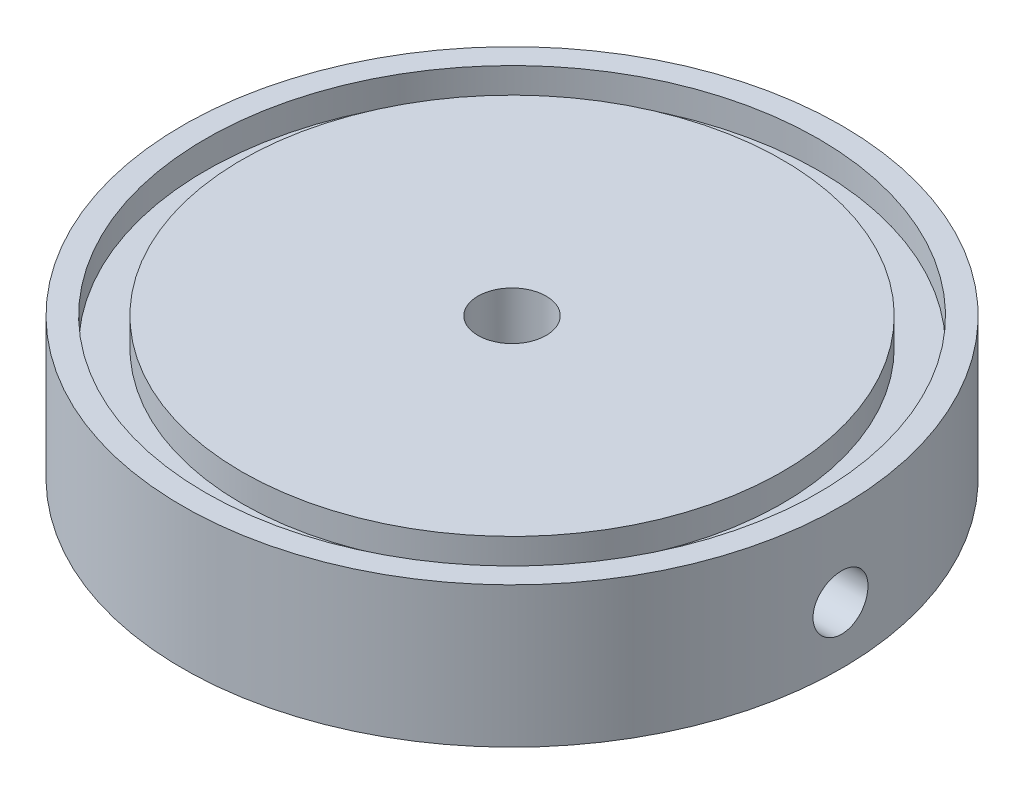
ISO-10303-21;
HEADER;
FILE_DESCRIPTION(('STEP AP214'),'2;1');
FILE_NAME('part.step','',(''),(''),'','','');
FILE_SCHEMA(('AUTOMOTIVE_DESIGN { 1 0 10303 214 1 1 1 1 }'));
ENDSEC;
DATA;
#1=APPLICATION_CONTEXT('core data for automotive mechanical design processes');
#2=APPLICATION_PROTOCOL_DEFINITION('international standard','automotive_design',2000,#1);
#3=PRODUCT_CONTEXT('',#1,'mechanical');
#4=PRODUCT('Part','Part','',(#3));
#5=PRODUCT_RELATED_PRODUCT_CATEGORY('part','',(#4));
#6=PRODUCT_DEFINITION_FORMATION('','',#4);
#7=PRODUCT_DEFINITION_CONTEXT('part definition',#1,'design');
#8=PRODUCT_DEFINITION('design','',#6,#7);
#9=PRODUCT_DEFINITION_SHAPE('','',#8);
#10=(LENGTH_UNIT() NAMED_UNIT(*) SI_UNIT(.MILLI.,.METRE.));
#11=(NAMED_UNIT(*) PLANE_ANGLE_UNIT() SI_UNIT($,.RADIAN.));
#12=(NAMED_UNIT(*) SI_UNIT($,.STERADIAN.) SOLID_ANGLE_UNIT());
#13=UNCERTAINTY_MEASURE_WITH_UNIT(LENGTH_MEASURE(1.E-05),#10,'distance_accuracy_value','');
#14=(GEOMETRIC_REPRESENTATION_CONTEXT(3) GLOBAL_UNCERTAINTY_ASSIGNED_CONTEXT((#13)) GLOBAL_UNIT_ASSIGNED_CONTEXT((#10,
#11,#12)) REPRESENTATION_CONTEXT('',''));
#15=CARTESIAN_POINT('',(0.,0.,0.));
#16=DIRECTION('',(0.,0.,1.));
#17=DIRECTION('',(1.,0.,0.));
#18=AXIS2_PLACEMENT_3D('',#15,#16,#17);
#19=CARTESIAN_POINT('',(38.1,-2.21742000000442,0.));
#20=DIRECTION('',(-1.,0.,0.));
#21=DIRECTION('',(0.,0.,1.));
#22=AXIS2_PLACEMENT_3D('',#19,#20,#21);
#23=CYLINDRICAL_SURFACE('',#22,1.7272);
#24=CARTESIAN_POINT('',(4.78697067852523,-0.665171235261735,-0.757458653891286));
#25=CARTESIAN_POINT('',(4.75625422953606,-0.635930548996629,-0.697533372590927));
#26=CARTESIAN_POINT('',(4.72893216465884,-0.609470565960408,-0.634482388105727));
#27=CARTESIAN_POINT('',(4.68213605994151,-0.563643555776028,-0.50306921919846));
#28=CARTESIAN_POINT('',(4.66266042825234,-0.544275090005549,-0.43470811542969));
#29=CARTESIAN_POINT('',(4.63231211537771,-0.513889935709503,-0.293951985284614));
#30=CARTESIAN_POINT('',(4.62147760516662,-0.502910312618153,-0.221540556224796));
#31=CARTESIAN_POINT('',(4.60903870850558,-0.490291871867994,-0.0751217236692977));
#32=CARTESIAN_POINT('',(4.60743266312804,-0.4886513753893,-0.00111460941827956));
#33=CARTESIAN_POINT('',(4.61336361058703,-0.494679348910777,0.14245074301311));
#34=CARTESIAN_POINT('',(4.62045190693207,-0.501890992455949,0.212047848188066));
#35=CARTESIAN_POINT('',(4.64273463588662,-0.52434487711953,0.348574343831421));
#36=CARTESIAN_POINT('',(4.65792891984075,-0.539586970967784,0.415503783197841));
#37=CARTESIAN_POINT('',(4.69608404535905,-0.577354018883261,0.545967186595631));
#38=CARTESIAN_POINT('',(4.71914668265209,-0.599974248749584,0.609443314302014));
#39=CARTESIAN_POINT('',(4.77210476899229,-0.651100559562644,0.730899392454943));
#40=CARTESIAN_POINT('',(4.8020029862676,-0.67960902463503,0.78887710269346));
#41=CARTESIAN_POINT('',(4.88192024901478,-0.754526280160981,0.922671170204856));
#42=CARTESIAN_POINT('',(4.93503823722558,-0.803331738258821,0.995297986812561));
#43=CARTESIAN_POINT('',(5.05039924550062,-0.906776183432052,1.12807541459497));
#44=CARTESIAN_POINT('',(5.11266285154989,-0.961428253273451,1.18819712022933));
#45=CARTESIAN_POINT('',(5.27630299315434,-1.10192049508507,1.32385964569084));
#46=CARTESIAN_POINT('',(5.3817783180933,-1.18980158095095,1.39228992218148));
#47=CARTESIAN_POINT('',(5.60174638633848,-1.36815861695864,1.5077448471841));
#48=CARTESIAN_POINT('',(5.71625795579938,-1.45863972073563,1.55472334408847));
#49=CARTESIAN_POINT('',(5.92763078684595,-1.6221177422067,1.62328310146144));
#50=CARTESIAN_POINT('',(6.02354233176437,-1.69505896722171,1.64804007283235));
#51=CARTESIAN_POINT('',(6.21772870089238,-1.84064222160262,1.68729031027404));
#52=CARTESIAN_POINT('',(6.31600494010158,-1.91328403974576,1.70177726461788));
#53=CARTESIAN_POINT('',(6.51422110198702,-2.05805523217336,1.72138595920732));
#54=CARTESIAN_POINT('',(6.61416464288552,-2.13018281605391,1.72648360307503));
#55=CARTESIAN_POINT('',(6.81474196617157,-2.27348375977993,1.72777573553129));
#56=CARTESIAN_POINT('',(6.91537557639753,-2.34465734541485,1.72397236958763));
#57=CARTESIAN_POINT('',(7.12168455036751,-2.48933143282605,1.70729152009641));
#58=CARTESIAN_POINT('',(7.22736495397619,-2.56277469486742,1.69397784330079));
#59=CARTESIAN_POINT('',(7.43816471586283,-2.70817059405486,1.65770938961245));
#60=CARTESIAN_POINT('',(7.54328385102441,-2.78012266704927,1.63475103133998));
#61=CARTESIAN_POINT('',(7.75166250948726,-2.92184595478182,1.57885512147153));
#62=CARTESIAN_POINT('',(7.85492808751473,-2.99162522016489,1.54596092672259));
#63=CARTESIAN_POINT('',(8.05894219324114,-3.12874148339489,1.46931337138522));
#64=CARTESIAN_POINT('',(8.15969293261694,-3.19608065255697,1.42556995117591));
#65=CARTESIAN_POINT('',(8.34279146757036,-3.31790402197057,1.33308588479146));
#66=CARTESIAN_POINT('',(8.42567839901411,-3.37282958961099,1.28600741540689));
#67=CARTESIAN_POINT('',(8.58722294170047,-3.47952178902698,1.18148485729486));
#68=CARTESIAN_POINT('',(8.66587290467,-3.5312827295557,1.12402278843746));
#69=CARTESIAN_POINT('',(8.81730672629618,-3.63066638778965,0.996297196430853));
#70=CARTESIAN_POINT('',(8.89000397489234,-3.67822860021844,0.92588119298211));
#71=CARTESIAN_POINT('',(9.02390983800553,-3.76564177324054,0.770767288220577));
#72=CARTESIAN_POINT('',(9.08516940480062,-3.80552695907134,0.686136080992624));
#73=CARTESIAN_POINT('',(9.16525579997495,-3.85759296052293,0.543951134303041));
#74=CARTESIAN_POINT('',(9.19067638740805,-3.87410210849061,0.491712966462728));
#75=CARTESIAN_POINT('',(9.23445776303899,-3.90251839072471,0.383148433261553));
#76=CARTESIAN_POINT('',(9.25282485409157,-3.91442963363101,0.326825771481761));
#77=CARTESIAN_POINT('',(9.2810805548836,-3.93274790973384,0.210605150804604));
#78=CARTESIAN_POINT('',(9.29088987886069,-3.93910347186559,0.150679144383298));
#79=CARTESIAN_POINT('',(9.30064503860262,-3.94542396950302,0.0296980409525031));
#80=CARTESIAN_POINT('',(9.30059713576054,-3.94539296181135,-0.0313563146720226));
#81=CARTESIAN_POINT('',(9.29122890951459,-3.93932310941666,-0.14549919115933));
#82=CARTESIAN_POINT('',(9.28294617064534,-3.93395654173932,-0.19871495761312));
#83=CARTESIAN_POINT('',(9.25936944941119,-3.91867309715279,-0.302875861226293));
#84=CARTESIAN_POINT('',(9.24407157626598,-3.90875369511765,-0.353819721098759));
#85=CARTESIAN_POINT('',(9.20096314906789,-3.88078203616598,-0.470334270253999));
#86=CARTESIAN_POINT('',(9.17063082628091,-3.8610876329992,-0.534571115967057));
#87=CARTESIAN_POINT('',(9.10179725928312,-3.81633686068641,-0.656447461342044));
#88=CARTESIAN_POINT('',(9.06327774394699,-3.79126849753343,-0.71407175352864));
#89=CARTESIAN_POINT('',(8.95707802252543,-3.72204583322611,-0.853427038623287));
#90=CARTESIAN_POINT('',(8.88517496885591,-3.67508247862191,-0.930507716123498));
#91=CARTESIAN_POINT('',(8.73276113117903,-3.57522834803393,-1.07099258277773));
#92=CARTESIAN_POINT('',(8.65223087948544,-3.52232415272656,-1.13436482302106));
#93=CARTESIAN_POINT('',(8.4965509103134,-3.41968473971726,-1.24199663584822));
#94=CARTESIAN_POINT('',(8.42204803621105,-3.37042166648861,-1.2876673135239));
#95=CARTESIAN_POINT('',(8.27019868913385,-3.26966196891126,-1.37123845324186));
#96=CARTESIAN_POINT('',(8.19285021193152,-3.21816376553295,-1.40913331005771));
#97=CARTESIAN_POINT('',(8.03606737113653,-3.11336290973551,-1.47798619281361));
#98=CARTESIAN_POINT('',(7.9566289112447,-3.06005664361635,-1.50892925406542));
#99=CARTESIAN_POINT('',(7.79642991727826,-2.9520721804854,-1.56434901597961));
#100=CARTESIAN_POINT('',(7.71566903621436,-2.89739362132667,-1.58882398964756));
#101=CARTESIAN_POINT('',(7.51886407635085,-2.76346880539695,-1.64078665460497));
#102=CARTESIAN_POINT('',(7.40238391256857,-2.68363910098292,-1.66514898834206));
#103=CARTESIAN_POINT('',(7.16877253520805,-2.52213916613266,-1.70212491606884));
#104=CARTESIAN_POINT('',(7.05164099265636,-2.44046792696191,-1.71473190244668));
#105=CARTESIAN_POINT('',(6.81786246557642,-2.27575422936096,-1.72818887092601));
#106=CARTESIAN_POINT('',(6.70121506046376,-2.19271359547437,-1.72905340229935));
#107=CARTESIAN_POINT('',(6.46936664569442,-2.02557001776367,-1.718551954237));
#108=CARTESIAN_POINT('',(6.35416470504726,-1.94146783596734,-1.70719430424913));
#109=CARTESIAN_POINT('',(6.10612982867684,-1.75758824532498,-1.66797102101825));
#110=CARTESIAN_POINT('',(5.97377251112206,-1.65766333372211,-1.63754625658014));
#111=CARTESIAN_POINT('',(5.78024403318545,-1.50818878630032,-1.5757846531622));
#112=CARTESIAN_POINT('',(5.71659631436929,-1.45845476401426,-1.55252396450989));
#113=CARTESIAN_POINT('',(5.59146640663726,-1.35941418178603,-1.50006247466696));
#114=CARTESIAN_POINT('',(5.52998347762886,-1.31010748018511,-1.47086372715697));
#115=CARTESIAN_POINT('',(5.38728220140971,-1.19400874201817,-1.39369146486403));
#116=CARTESIAN_POINT('',(5.30730539323905,-1.12759071336931,-1.34278304649939));
#117=CARTESIAN_POINT('',(5.15519035730813,-0.998393264074577,-1.22666501174239));
#118=CARTESIAN_POINT('',(5.08303677989516,-0.935606835294663,-1.16148418671653));
#119=CARTESIAN_POINT('',(4.97257932380863,-0.837171800965483,-1.04018392483871));
#120=CARTESIAN_POINT('',(4.93111600422493,-0.799563137637129,-0.988538194437073));
#121=CARTESIAN_POINT('',(4.85421423295613,-0.728701068483842,-0.878195991255441));
#122=CARTESIAN_POINT('',(4.81877313109346,-0.695445748384531,-0.819502639407449));
#123=CARTESIAN_POINT('',(4.78697067852523,-0.665171235261735,-0.757458653891286));
#124=B_SPLINE_CURVE_WITH_KNOTS('',3,(#24,#25,#26,#27,#28,#29,#30,#31,#32,#33,#34,#35,#36,#37,
#38,#39,#40,#41,#42,#43,#44,#45,#46,#47,#48,#49,#50,#51,#52,#53,#54,#55,#56,#57,#58,#59,#60,#61,
#62,#63,#64,#65,#66,#67,#68,#69,#70,#71,#72,#73,#74,#75,#76,#77,#78,#79,#80,#81,#82,#83,#84,#85,
#86,#87,#88,#89,#90,#91,#92,#93,#94,#95,#96,#97,#98,#99,#100,#101,#102,#103,#104,#105,#106,#107,
#108,#109,#110,#111,#112,#113,#114,#115,#116,#117,#118,#119,#120,#121,#122,#123),.UNSPECIFIED.,
.T.,.F.,(4,2,2,2,2,2,2,2,2,2,2,2,2,2,2,2,2,2,2,2,2,2,2,2,2,2,2,2,2,2,2,2,2,2,2,2,2,2,2,2,2,2,2,
2,2,2,2,2,2,4),(0.,0.220037701199797,0.440030739634494,0.660990266743245,0.881910072475531,
1.0918930860338,1.30187224885474,1.51467803475821,1.7275701544815,2.03292991566579,
2.33898785804739,2.79662553769652,3.25524319850504,3.62380199616927,3.99258710607117,
4.36231734070705,4.73195846605978,5.11974146230725,5.50766858228649,5.89392678405249,
6.27983238368667,6.60939257235968,6.93952898976279,7.27383398599623,7.60661221229129,
7.78721266741637,7.96765136419895,8.1497445532452,8.33172207552924,8.4933480581582,
8.65506379148425,8.87497648798497,9.09538520940238,9.4396527596983,9.78471421651974,
10.0852441851602,10.3859900366169,10.6873772102741,10.9888447738919,11.4181810801262,
11.8477585685627,12.2768037483284,12.705556717773,13.2099601805762,13.4619379183584,
13.7138286572654,14.0601429246107,14.4057649135186,14.6336827764579,14.8615000791056),.UNSPECIFIED.);
#125=CARTESIAN_POINT('',(4.78697067852523,-0.665171235261735,-0.757458653891286));
#126=VERTEX_POINT('',#125);
#127=EDGE_CURVE('E157',#126,#126,#124,.T.);
#128=ORIENTED_EDGE('',*,*,#127,.F.);
#129=EDGE_LOOP('',(#128));
#130=FACE_BOUND('',#129,.T.);
#131=CARTESIAN_POINT('',(28.575,-2.21742000000442,0.));
#132=DIRECTION('',(1.,0.,0.));
#133=DIRECTION('',(0.,0.,-1.));
#134=AXIS2_PLACEMENT_3D('',#131,#132,#133);
#135=CIRCLE('',#134,1.7272);
#136=CARTESIAN_POINT('',(28.575,-2.21742000000442,-1.7272));
#137=VERTEX_POINT('',#136);
#138=EDGE_CURVE('E53',#137,#137,#135,.T.);
#139=ORIENTED_EDGE('',*,*,#138,.T.);
#140=EDGE_LOOP('',(#139));
#141=FACE_BOUND('',#140,.T.);
#142=ADVANCED_FACE('F31',(#130,#141),#23,.F.);
#143=CARTESIAN_POINT('',(3.94335000000002,7.43457999999557,0.));
#144=DIRECTION('',(0.,1.,0.));
#145=DIRECTION('',(0.,0.,1.));
#146=AXIS2_PLACEMENT_3D('',#143,#144,#145);
#147=PLANE('',#146);
#148=CARTESIAN_POINT('',(0.,7.43457999999557,0.));
#149=DIRECTION('',(0.,-1.,0.));
#150=DIRECTION('',(0.,0.,-1.));
#151=AXIS2_PLACEMENT_3D('',#148,#149,#150);
#152=CIRCLE('',#151,3.94334999999996);
#153=CARTESIAN_POINT('',(0.,7.43457999999557,-3.94334999999996));
#154=VERTEX_POINT('',#153);
#155=EDGE_CURVE('E163',#154,#154,#152,.T.);
#156=ORIENTED_EDGE('',*,*,#155,.T.);
#157=EDGE_LOOP('',(#156));
#158=FACE_BOUND('',#157,.T.);
#159=CARTESIAN_POINT('',(0.,7.43457999999557,0.));
#160=DIRECTION('',(0.,1.,0.));
#161=DIRECTION('',(0.,0.,1.));
#162=AXIS2_PLACEMENT_3D('',#159,#160,#161);
#163=CIRCLE('',#162,31.242);
#164=CARTESIAN_POINT('',(0.,7.43457999999557,31.242));
#165=VERTEX_POINT('',#164);
#166=EDGE_CURVE('E315',#165,#165,#163,.T.);
#167=ORIENTED_EDGE('',*,*,#166,.T.);
#168=EDGE_LOOP('',(#167));
#169=FACE_BOUND('',#168,.T.);
#170=ADVANCED_FACE('F154',(#158,#169),#147,.T.);
#171=CARTESIAN_POINT('',(0.,-4.42701431069281E-12,0.));
#172=DIRECTION('',(0.,-1.,0.));
#173=DIRECTION('',(0.,0.,-1.));
#174=AXIS2_PLACEMENT_3D('',#171,#172,#173);
#175=CONICAL_SURFACE('',#174,3.94334999999996,0.936005153411921);
#176=CARTESIAN_POINT('',(0.,-0.380669706682652,0.));
#177=DIRECTION('',(0.,1.,0.));
#178=DIRECTION('',(0.,0.,1.));
#179=AXIS2_PLACEMENT_3D('',#176,#177,#178);
#180=CIRCLE('',#179,4.46022808609899);
#181=CARTESIAN_POINT('',(0.,-0.380669706682652,4.46022808609899));
#182=VERTEX_POINT('',#181);
#183=EDGE_CURVE('E10',#182,#182,#180,.T.);
#184=ORIENTED_EDGE('',*,*,#183,.T.);
#185=EDGE_LOOP('',(#184));
#186=FACE_BOUND('',#185,.T.);
#187=CARTESIAN_POINT('',(0.,-4.06400000000444,0.));
#188=DIRECTION('',(0.,-1.,0.));
#189=DIRECTION('',(0.,0.,-1.));
#190=AXIS2_PLACEMENT_3D('',#187,#188,#189);
#191=CIRCLE('',#190,9.46149999999993);
#192=CARTESIAN_POINT('',(0.,-4.06400000000444,-9.46149999999993));
#193=VERTEX_POINT('',#192);
#194=EDGE_CURVE('E46',#193,#193,#191,.T.);
#195=ORIENTED_EDGE('',*,*,#194,.T.);
#196=EDGE_LOOP('',(#195));
#197=FACE_BOUND('',#196,.T.);
#198=ORIENTED_EDGE('',*,*,#127,.T.);
#199=EDGE_LOOP('',(#198));
#200=FACE_BOUND('',#199,.T.);
#201=ADVANCED_FACE('F168',(#186,#197,#200),#175,.F.);
#202=CARTESIAN_POINT('',(0.,101.604645460313,0.));
#203=DIRECTION('',(0.,-1.,0.));
#204=DIRECTION('',(0.,0.,-1.));
#205=AXIS2_PLACEMENT_3D('',#202,#203,#204);
#206=CYLINDRICAL_SURFACE('',#205,38.1);
#207=CARTESIAN_POINT('',(37.967477859347,-2.21742000000442,-3.175));
#208=CARTESIAN_POINT('',(37.9674796148514,-2.03941137459055,-3.174992223886));
#209=CARTESIAN_POINT('',(37.9687432124492,-1.86128156393965,-3.15997936696993));
#210=CARTESIAN_POINT('',(37.9736610260084,-1.50995056040072,-3.10031123355846));
#211=CARTESIAN_POINT('',(37.9773179506743,-1.3367551842216,-3.05562236969804));
#212=CARTESIAN_POINT('',(37.9866053672743,-1.00043235231119,-2.93790365154258));
#213=CARTESIAN_POINT('',(37.9922347401669,-0.837299249473696,-2.86488986449255));
#214=CARTESIAN_POINT('',(38.0048313657025,-0.525642855211689,-2.69262246744107));
#215=CARTESIAN_POINT('',(38.0117983322355,-0.37711644968433,-2.59337446720523));
#216=CARTESIAN_POINT('',(38.0263052267685,-0.0984694402681578,-2.37118060325433));
#217=CARTESIAN_POINT('',(38.033846422922,0.0316084961604079,-2.24818130945098));
#218=CARTESIAN_POINT('',(38.0486404573867,0.269299582801398,-1.98208938314658));
#219=CARTESIAN_POINT('',(38.0558932830885,0.376911751528684,-1.83899587322542));
#220=CARTESIAN_POINT('',(38.0693053861151,0.566758501528934,-1.53652297885541));
#221=CARTESIAN_POINT('',(38.0754630672337,0.648956167096674,-1.3771203474996));
#222=CARTESIAN_POINT('',(38.0859774147698,0.785404484296812,-1.04671622158357));
#223=CARTESIAN_POINT('',(38.0903341127107,0.839655625094882,-0.875714930101312));
#224=CARTESIAN_POINT('',(38.0967467506224,0.91854808623849,-0.527392252134299));
#225=CARTESIAN_POINT('',(38.0988080535635,0.943258435799819,-0.35008660053762));
#226=CARTESIAN_POINT('',(38.1004158213117,0.96258127010665,0.00616674500017729));
#227=CARTESIAN_POINT('',(38.0999623328846,0.95719431455252,0.185114408344068));
#228=CARTESIAN_POINT('',(38.0965960392816,0.916531910326071,0.539104051072238));
#229=CARTESIAN_POINT('',(38.0936893421403,0.881330692867241,0.71415462348008));
#230=CARTESIAN_POINT('',(38.0857505953842,0.782154420690949,1.05585407967778));
#231=CARTESIAN_POINT('',(38.0807185255475,0.718179092201481,1.22250288351202));
#232=CARTESIAN_POINT('',(38.0690846412153,0.563187890894124,1.54290446002202));
#233=CARTESIAN_POINT('',(38.0624808988053,0.472138773144508,1.69664107794224));
#234=CARTESIAN_POINT('',(38.0484457872988,0.265608683983459,1.98667794141065));
#235=CARTESIAN_POINT('',(38.0410144014161,0.150127216994747,2.12297783318834));
#236=CARTESIAN_POINT('',(38.0261325057258,-0.102407846862345,2.37470621318252));
#237=CARTESIAN_POINT('',(38.0186820064471,-0.239525945954131,2.49007000291146));
#238=CARTESIAN_POINT('',(38.004624326273,-0.531217203748763,2.69615157657959));
#239=CARTESIAN_POINT('',(37.9980171460728,-0.685790376840318,2.78686934020215));
#240=CARTESIAN_POINT('',(37.9863929785793,-1.00804944367989,2.94108125458357));
#241=CARTESIAN_POINT('',(37.9813761874431,-1.17573695176081,3.00457204753268));
#242=CARTESIAN_POINT('',(37.9735046116394,-1.51944297981634,3.10247984731552));
#243=CARTESIAN_POINT('',(37.9706497815192,-1.69546132456204,3.136897465381));
#244=CARTESIAN_POINT('',(37.967432729465,-2.05026636731748,3.17560002074756));
#245=CARTESIAN_POINT('',(37.9670630442666,-2.22904315889829,3.17997518092429));
#246=CARTESIAN_POINT('',(37.9688384390387,-2.584787641092,3.15870496351731));
#247=CARTESIAN_POINT('',(37.9709834955532,-2.7617553485634,3.13305986594426));
#248=CARTESIAN_POINT('',(37.9775398735957,-3.10859917966798,3.05255231894487));
#249=CARTESIAN_POINT('',(37.981947928906,-3.27848514343725,2.99773197439151));
#250=CARTESIAN_POINT('',(37.9925309166027,-3.6066478608743,2.86047288657974));
#251=CARTESIAN_POINT('',(37.9987058773397,-3.76492442821541,2.77803370016694));
#252=CARTESIAN_POINT('',(38.0121450024562,-4.06578832580058,2.58764877433316));
#253=CARTESIAN_POINT('',(38.0194117192608,-4.20833749516941,2.47964291244999));
#254=CARTESIAN_POINT('',(38.0342069443175,-4.47331446238362,2.24127735771924));
#255=CARTESIAN_POINT('',(38.0417354570727,-4.59574191391979,2.11091728021842));
#256=CARTESIAN_POINT('',(38.0562282152053,-4.8173081383243,1.83115385899478));
#257=CARTESIAN_POINT('',(38.0631910120889,-4.91638829078934,1.68170400390121));
#258=CARTESIAN_POINT('',(38.0757469329061,-5.08804517557185,1.36823511345573));
#259=CARTESIAN_POINT('',(38.0813400705265,-5.16062217273458,1.20421622371214));
#260=CARTESIAN_POINT('',(38.0905198062144,-5.27711188167546,0.866475212585343));
#261=CARTESIAN_POINT('',(38.0941089410165,-5.32106084359246,0.692765665902921));
#262=CARTESIAN_POINT('',(38.0988865697222,-5.37916540927367,0.340401843535496));
#263=CARTESIAN_POINT('',(38.1000751090659,-5.39332157697817,0.161747661511103));
#264=CARTESIAN_POINT('',(38.0999176999798,-5.39143213177133,-0.194856253656991));
#265=CARTESIAN_POINT('',(38.0985794181538,-5.37547787666705,-0.372806481371152));
#266=CARTESIAN_POINT('',(38.0935339028085,-5.31401097943029,-0.723490780794735));
#267=CARTESIAN_POINT('',(38.0898266660717,-5.26849829715076,-0.896224845419092));
#268=CARTESIAN_POINT('',(38.0804591991,-5.14922969986591,-1.23157947247479));
#269=CARTESIAN_POINT('',(38.0747990823492,-5.07547542598607,-1.39420062193183));
#270=CARTESIAN_POINT('',(38.0621590787552,-4.90182774586677,-1.7047672689544));
#271=CARTESIAN_POINT('',(38.055179212783,-4.80193475298898,-1.85271299854823));
#272=CARTESIAN_POINT('',(38.0406579324267,-4.57850235285857,-2.13019668392583));
#273=CARTESIAN_POINT('',(38.0331149513177,-4.45489534677913,-2.25968012625115));
#274=CARTESIAN_POINT('',(38.0183309031222,-4.1876657142995,-2.49611459932655));
#275=CARTESIAN_POINT('',(38.0110899095966,-4.04403824769125,-2.60306016549813));
#276=CARTESIAN_POINT('',(37.9977149749742,-3.74056592277891,-2.79152787825786));
#277=CARTESIAN_POINT('',(37.9915831336506,-3.58069118125046,-2.87300201198062));
#278=CARTESIAN_POINT('',(37.981146402472,-3.24958888837208,-3.00784546046481));
#279=CARTESIAN_POINT('',(37.9768394132918,-3.07837464582989,-3.0612470872011));
#280=CARTESIAN_POINT('',(37.971647709959,-2.79136194258297,-3.1248289611693));
#281=CARTESIAN_POINT('',(37.9700912043148,-2.67740938743211,-3.14361809063546));
#282=CARTESIAN_POINT('',(37.9680057114582,-2.44812818992463,-3.16870611338372));
#283=CARTESIAN_POINT('',(37.9674767214846,-2.33279955126678,-3.17500504023073));
#284=CARTESIAN_POINT('',(37.967477859347,-2.21742000000442,-3.175));
#285=B_SPLINE_CURVE_WITH_KNOTS('',3,(#207,#208,#209,#210,#211,#212,#213,#214,#215,#216,#217,
#218,#219,#220,#221,#222,#223,#224,#225,#226,#227,#228,#229,#230,#231,#232,#233,#234,#235,#236,
#237,#238,#239,#240,#241,#242,#243,#244,#245,#246,#247,#248,#249,#250,#251,#252,#253,#254,#255,
#256,#257,#258,#259,#260,#261,#262,#263,#264,#265,#266,#267,#268,#269,#270,#271,#272,#273,#274,
#275,#276,#277,#278,#279,#280,#281,#282,#283,#284),.UNSPECIFIED.,.T.,.F.,(4,2,2,2,2,2,2,2,2,2,2,
2,2,2,2,2,2,2,2,2,2,2,2,2,2,2,2,2,2,2,2,2,2,2,2,2,2,2,4),(0.,0.533604603517507,1.06781417349037,
1.60172115641093,2.13551406411709,2.67052206526965,3.2055534349789,3.74135834978334,
4.27715388573729,4.81169494296257,5.34622605970216,5.87943020597204,6.41263942553357,
6.94650611589526,7.4803836360617,8.01588389273743,8.55138459084428,9.08695131145285,
9.62250677207596,10.1564531576629,10.6903945629631,11.2235674807547,11.7567489539102,
12.2911969327788,12.8256541089181,13.3614392326626,13.8972190021753,14.4323190169852,
14.9674089029308,15.5008778862256,16.0343475940937,16.5677863066157,17.1012165837663,
17.6361906712906,18.1712943208452,18.7074006261176,19.2428885044878,19.5887550320896,
19.9346206302438),.UNSPECIFIED.);
#286=CARTESIAN_POINT('',(37.967477859347,-2.21742000000442,-3.175));
#287=VERTEX_POINT('',#286);
#288=EDGE_CURVE('E42',#287,#287,#285,.T.);
#289=ORIENTED_EDGE('',*,*,#288,.F.);
#290=EDGE_LOOP('',(#289));
#291=FACE_BOUND('',#290,.T.);
#292=CARTESIAN_POINT('',(0.,7.43457999999558,0.));
#293=DIRECTION('',(0.,-1.,0.));
#294=DIRECTION('',(0.,0.,-1.));
#295=AXIS2_PLACEMENT_3D('',#292,#293,#294);
#296=CIRCLE('',#295,38.1);
#297=CARTESIAN_POINT('',(0.,7.43457999999558,-38.1));
#298=VERTEX_POINT('',#297);
#299=EDGE_CURVE('E251',#298,#298,#296,.T.);
#300=ORIENTED_EDGE('',*,*,#299,.T.);
#301=EDGE_LOOP('',(#300));
#302=FACE_BOUND('',#301,.T.);
#303=CARTESIAN_POINT('',(0.,-8.82142000000442,0.));
#304=DIRECTION('',(0.,-1.,0.));
#305=DIRECTION('',(0.,0.,-1.));
#306=AXIS2_PLACEMENT_3D('',#303,#304,#305);
#307=CIRCLE('',#306,38.1);
#308=CARTESIAN_POINT('',(0.,-8.82142000000442,-38.1));
#309=VERTEX_POINT('',#308);
#310=EDGE_CURVE('E242',#309,#309,#307,.T.);
#311=ORIENTED_EDGE('',*,*,#310,.F.);
#312=EDGE_LOOP('',(#311));
#313=FACE_BOUND('',#312,.T.);
#314=ADVANCED_FACE('F55',(#291,#302,#313),#206,.T.);
#315=CARTESIAN_POINT('',(0.,-6.391948453042,0.));
#316=DIRECTION('',(0.,-1.,0.));
#317=DIRECTION('',(0.,0.,-1.));
#318=AXIS2_PLACEMENT_3D('',#315,#316,#317);
#319=TOROIDAL_SURFACE('',#318,8.44549999999992,2.54);
#320=CARTESIAN_POINT('',(0.,-6.391948453042,0.));
#321=DIRECTION('',(0.,-1.,0.));
#322=DIRECTION('',(0.,0.,-1.));
#323=AXIS2_PLACEMENT_3D('',#320,#321,#322);
#324=CIRCLE('',#323,10.9854999999999);
#325=CARTESIAN_POINT('',(0.,-6.391948453042,-10.9854999999999));
#326=VERTEX_POINT('',#325);
#327=EDGE_CURVE('E262',#326,#326,#324,.T.);
#328=ORIENTED_EDGE('',*,*,#327,.T.);
#329=EDGE_LOOP('',(#328));
#330=FACE_BOUND('',#329,.T.);
#331=ORIENTED_EDGE('',*,*,#194,.F.);
#332=EDGE_LOOP('',(#331));
#333=FACE_BOUND('',#332,.T.);
#334=ADVANCED_FACE('F172',(#330,#333),#319,.F.);
#335=CARTESIAN_POINT('',(0.,101.604645460313,0.));
#336=DIRECTION('',(0.,-1.,0.));
#337=DIRECTION('',(0.,0.,-1.));
#338=AXIS2_PLACEMENT_3D('',#335,#336,#337);
#339=CYLINDRICAL_SURFACE('',#338,10.9854999999999);
#340=CARTESIAN_POINT('',(0.,-8.82650000000443,0.));
#341=DIRECTION('',(0.,-1.,0.));
#342=DIRECTION('',(0.,0.,-1.));
#343=AXIS2_PLACEMENT_3D('',#340,#341,#342);
#344=CIRCLE('',#343,10.9854999999999);
#345=CARTESIAN_POINT('',(0.,-8.82650000000443,-10.9854999999999));
#346=VERTEX_POINT('',#345);
#347=EDGE_CURVE('E259',#346,#346,#344,.T.);
#348=ORIENTED_EDGE('',*,*,#347,.T.);
#349=EDGE_LOOP('',(#348));
#350=FACE_BOUND('',#349,.T.);
#351=ORIENTED_EDGE('',*,*,#327,.F.);
#352=EDGE_LOOP('',(#351));
#353=FACE_BOUND('',#352,.T.);
#354=ADVANCED_FACE('F175',(#350,#353),#339,.F.);
#355=CARTESIAN_POINT('',(10.9855,-8.82650000000443,0.));
#356=DIRECTION('',(0.,-1.,0.));
#357=DIRECTION('',(0.,0.,-1.));
#358=AXIS2_PLACEMENT_3D('',#355,#356,#357);
#359=PLANE('',#358);
#360=CARTESIAN_POINT('',(0.,-8.82650000000443,0.));
#361=DIRECTION('',(0.,-1.,0.));
#362=DIRECTION('',(0.,0.,-1.));
#363=AXIS2_PLACEMENT_3D('',#360,#361,#362);
#364=CIRCLE('',#363,21.1454999999999);
#365=CARTESIAN_POINT('',(0.,-8.82650000000443,-21.1454999999999));
#366=VERTEX_POINT('',#365);
#367=EDGE_CURVE('E256',#366,#366,#364,.T.);
#368=ORIENTED_EDGE('',*,*,#367,.T.);
#369=EDGE_LOOP('',(#368));
#370=FACE_BOUND('',#369,.T.);
#371=ORIENTED_EDGE('',*,*,#347,.F.);
#372=EDGE_LOOP('',(#371));
#373=FACE_BOUND('',#372,.T.);
#374=ADVANCED_FACE('F179',(#370,#373),#359,.T.);
#375=CARTESIAN_POINT('',(0.,101.604645460313,0.));
#376=DIRECTION('',(0.,-1.,0.));
#377=DIRECTION('',(0.,0.,-1.));
#378=AXIS2_PLACEMENT_3D('',#375,#376,#377);
#379=CYLINDRICAL_SURFACE('',#378,21.1454999999999);
#380=CARTESIAN_POINT('',(0.,-7.81050000000444,0.));
#381=DIRECTION('',(0.,-1.,0.));
#382=DIRECTION('',(0.,0.,-1.));
#383=AXIS2_PLACEMENT_3D('',#380,#381,#382);
#384=CIRCLE('',#383,21.1454999999999);
#385=CARTESIAN_POINT('',(0.,-7.81050000000444,-21.1454999999999));
#386=VERTEX_POINT('',#385);
#387=EDGE_CURVE('E249',#386,#386,#384,.T.);
#388=ORIENTED_EDGE('',*,*,#387,.T.);
#389=EDGE_LOOP('',(#388));
#390=FACE_BOUND('',#389,.T.);
#391=ORIENTED_EDGE('',*,*,#367,.F.);
#392=EDGE_LOOP('',(#391));
#393=FACE_BOUND('',#392,.T.);
#394=ADVANCED_FACE('F183',(#390,#393),#379,.T.);
#395=CARTESIAN_POINT('',(21.1455,-7.81050000000443,0.));
#396=DIRECTION('',(0.,-1.,0.));
#397=DIRECTION('',(0.,0.,-1.));
#398=AXIS2_PLACEMENT_3D('',#395,#396,#397);
#399=PLANE('',#398);
#400=CARTESIAN_POINT('',(0.,-7.81050000000444,0.));
#401=DIRECTION('',(0.,-1.,0.));
#402=DIRECTION('',(0.,0.,-1.));
#403=AXIS2_PLACEMENT_3D('',#400,#401,#402);
#404=CIRCLE('',#403,22.6694999999999);
#405=CARTESIAN_POINT('',(0.,-7.81050000000444,-22.6694999999999));
#406=VERTEX_POINT('',#405);
#407=EDGE_CURVE('E246',#406,#406,#404,.T.);
#408=ORIENTED_EDGE('',*,*,#407,.T.);
#409=EDGE_LOOP('',(#408));
#410=FACE_BOUND('',#409,.T.);
#411=ORIENTED_EDGE('',*,*,#387,.F.);
#412=EDGE_LOOP('',(#411));
#413=FACE_BOUND('',#412,.T.);
#414=ADVANCED_FACE('F187',(#410,#413),#399,.T.);
#415=CARTESIAN_POINT('',(0.,101.604645460313,0.));
#416=DIRECTION('',(0.,-1.,0.));
#417=DIRECTION('',(0.,0.,-1.));
#418=AXIS2_PLACEMENT_3D('',#415,#416,#417);
#419=CYLINDRICAL_SURFACE('',#418,22.6694999999999);
#420=CARTESIAN_POINT('',(0.,-8.82142000000442,0.));
#421=DIRECTION('',(0.,-1.,0.));
#422=DIRECTION('',(0.,0.,-1.));
#423=AXIS2_PLACEMENT_3D('',#420,#421,#422);
#424=CIRCLE('',#423,22.6694999999999);
#425=CARTESIAN_POINT('',(0.,-8.82142000000442,-22.6694999999999));
#426=VERTEX_POINT('',#425);
#427=EDGE_CURVE('E245',#426,#426,#424,.T.);
#428=ORIENTED_EDGE('',*,*,#427,.T.);
#429=EDGE_LOOP('',(#428));
#430=FACE_BOUND('',#429,.T.);
#431=ORIENTED_EDGE('',*,*,#407,.F.);
#432=EDGE_LOOP('',(#431));
#433=FACE_BOUND('',#432,.T.);
#434=ADVANCED_FACE('F191',(#430,#433),#419,.F.);
#435=CARTESIAN_POINT('',(22.6695,-8.82142000000442,0.));
#436=DIRECTION('',(0.,-1.,0.));
#437=DIRECTION('',(0.,0.,-1.));
#438=AXIS2_PLACEMENT_3D('',#435,#436,#437);
#439=PLANE('',#438);
#440=CARTESIAN_POINT('',(-4.85173008401352,-8.82142000000442,-27.5155286191612));
#441=DIRECTION('',(0.,-1.,0.));
#442=DIRECTION('',(-0.64278760968653,0.,-0.766044443118986));
#443=AXIS2_PLACEMENT_3D('',#440,#441,#442);
#444=CIRCLE('',#443,1.03251);
#445=CARTESIAN_POINT('',(-5.51541471889096,-8.82142000000442,-28.306477167126));
#446=VERTEX_POINT('',#445);
#447=EDGE_CURVE('E206',#446,#446,#444,.T.);
#448=ORIENTED_EDGE('',*,*,#447,.F.);
#449=EDGE_LOOP('',(#448));
#450=FACE_BOUND('',#449,.T.);
#451=CARTESIAN_POINT('',(-21.403281740744,-8.82142000000442,-17.9594858146423));
#452=DIRECTION('',(0.,-1.,0.));
#453=DIRECTION('',(-0.984807753012206,0.,-0.17364817766694));
#454=AXIS2_PLACEMENT_3D('',#451,#452,#453);
#455=CIRCLE('',#454,1.03251);
#456=CARTESIAN_POINT('',(-22.4201055938066,-8.82142000000442,-18.1387792945652));
#457=VERTEX_POINT('',#456);
#458=EDGE_CURVE('E210',#457,#457,#455,.T.);
#459=ORIENTED_EDGE('',*,*,#458,.F.);
#460=EDGE_LOOP('',(#459));
#461=FACE_BOUND('',#460,.T.);
#462=CARTESIAN_POINT('',(-27.94,-8.82142000000442,-4.47558656802016E-13));
#463=DIRECTION('',(0.,-1.,0.));
#464=DIRECTION('',(-0.866025403784443,0.,0.499999999999992));
#465=AXIS2_PLACEMENT_3D('',#462,#463,#464);
#466=CIRCLE('',#465,1.03251);
#467=CARTESIAN_POINT('',(-28.8341798896615,-8.82142000000442,0.516254999999544));
#468=VERTEX_POINT('',#467);
#469=EDGE_CURVE('E214',#468,#468,#466,.T.);
#470=ORIENTED_EDGE('',*,*,#469,.F.);
#471=EDGE_LOOP('',(#470));
#472=FACE_BOUND('',#471,.T.);
#473=CARTESIAN_POINT('',(-21.4032817407445,-8.82142000000442,17.9594858146416));
#474=DIRECTION('',(0.,-1.,0.));
#475=DIRECTION('',(-0.342020143325676,0.,0.939692620785906));
#476=AXIS2_PLACEMENT_3D('',#473,#474,#475);
#477=CIRCLE('',#476,1.03251);
#478=CARTESIAN_POINT('',(-21.7564209589297,-8.82142000000442,18.9297278425293));
#479=VERTEX_POINT('',#478);
#480=EDGE_CURVE('E218',#479,#479,#477,.T.);
#481=ORIENTED_EDGE('',*,*,#480,.F.);
#482=EDGE_LOOP('',(#481));
#483=FACE_BOUND('',#482,.T.);
#484=CARTESIAN_POINT('',(-4.85173008401439,-8.82142000000442,27.5155286191611));
#485=DIRECTION('',(0.,-1.,0.));
#486=DIRECTION('',(0.342020143325663,0.,0.939692620785911));
#487=AXIS2_PLACEMENT_3D('',#484,#485,#486);
#488=CIRCLE('',#487,1.03251);
#489=CARTESIAN_POINT('',(-4.49859086582921,-8.82142000000442,28.4857706470487));
#490=VERTEX_POINT('',#489);
#491=EDGE_CURVE('E222',#490,#490,#488,.T.);
#492=ORIENTED_EDGE('',*,*,#491,.F.);
#493=EDGE_LOOP('',(#492));
#494=FACE_BOUND('',#493,.T.);
#495=CARTESIAN_POINT('',(13.9699999999997,-8.82142000000442,24.1967497817374));
#496=DIRECTION('',(0.,-1.,0.));
#497=DIRECTION('',(0.866025403784436,0.,0.500000000000004));
#498=AXIS2_PLACEMENT_3D('',#495,#496,#497);
#499=CIRCLE('',#498,1.03251);
#500=CARTESIAN_POINT('',(14.8641798896612,-8.82142000000442,24.7130047817374));
#501=VERTEX_POINT('',#500);
#502=EDGE_CURVE('E226',#501,#501,#499,.T.);
#503=ORIENTED_EDGE('',*,*,#502,.F.);
#504=EDGE_LOOP('',(#503));
#505=FACE_BOUND('',#504,.T.);
#506=CARTESIAN_POINT('',(26.2550118247582,-8.82142000000442,9.55604280451945));
#507=DIRECTION('',(0.,-1.,0.));
#508=DIRECTION('',(0.984807753012209,0.,-0.173648177666927));
#509=AXIS2_PLACEMENT_3D('',#506,#507,#508);
#510=CIRCLE('',#509,1.03251);
#511=CARTESIAN_POINT('',(27.2718356778208,-8.82142000000442,9.37674932459657));
#512=VERTEX_POINT('',#511);
#513=EDGE_CURVE('E230',#512,#512,#510,.T.);
#514=ORIENTED_EDGE('',*,*,#513,.F.);
#515=EDGE_LOOP('',(#514));
#516=FACE_BOUND('',#515,.T.);
#517=CARTESIAN_POINT('',(26.2550118247584,-8.82142000000442,-9.55604280451898));
#518=DIRECTION('',(0.,-1.,0.));
#519=DIRECTION('',(0.642787609686541,0.,-0.766044443118977));
#520=AXIS2_PLACEMENT_3D('',#517,#518,#519);
#521=CIRCLE('',#520,1.03251);
#522=CARTESIAN_POINT('',(26.9186964596358,-8.82142000000442,-10.3469913524838));
#523=VERTEX_POINT('',#522);
#524=EDGE_CURVE('E234',#523,#523,#521,.T.);
#525=ORIENTED_EDGE('',*,*,#524,.F.);
#526=EDGE_LOOP('',(#525));
#527=FACE_BOUND('',#526,.T.);
#528=CARTESIAN_POINT('',(13.9700000000002,-8.82142000000442,-24.1967497817372));
#529=DIRECTION('',(0.,-1.,0.));
#530=DIRECTION('',(0.,0.,-1.));
#531=AXIS2_PLACEMENT_3D('',#528,#529,#530);
#532=CIRCLE('',#531,1.03251);
#533=CARTESIAN_POINT('',(13.9700000000002,-8.82142000000442,-25.2292597817372));
#534=VERTEX_POINT('',#533);
#535=EDGE_CURVE('E238',#534,#534,#532,.T.);
#536=ORIENTED_EDGE('',*,*,#535,.F.);
#537=EDGE_LOOP('',(#536));
#538=FACE_BOUND('',#537,.T.);
#539=ORIENTED_EDGE('',*,*,#310,.T.);
#540=EDGE_LOOP('',(#539));
#541=FACE_BOUND('',#540,.T.);
#542=ORIENTED_EDGE('',*,*,#427,.F.);
#543=EDGE_LOOP('',(#542));
#544=FACE_BOUND('',#543,.T.);
#545=ADVANCED_FACE('F194',(#450,#461,#472,#483,#494,#505,#516,#527,#538,#541,#544),#439,.T.);
#546=CARTESIAN_POINT('',(0.,7.43457999999557,0.));
#547=DIRECTION('',(0.,1.,0.));
#548=DIRECTION('',(0.,0.,1.));
#549=AXIS2_PLACEMENT_3D('',#546,#547,#548);
#550=CIRCLE('',#549,35.433);
#551=CARTESIAN_POINT('',(0.,7.43457999999557,35.433));
#552=VERTEX_POINT('',#551);
#553=EDGE_CURVE('E165',#552,#552,#550,.T.);
#554=ORIENTED_EDGE('',*,*,#553,.F.);
#555=EDGE_LOOP('',(#554));
#556=FACE_BOUND('',#555,.T.);
#557=ORIENTED_EDGE('',*,*,#299,.F.);
#558=EDGE_LOOP('',(#557));
#559=FACE_BOUND('',#558,.T.);
#560=ADVANCED_FACE('F197',(#556,#559),#147,.T.);
#561=CARTESIAN_POINT('',(0.,101.604645460313,0.));
#562=DIRECTION('',(0.,-1.,0.));
#563=DIRECTION('',(0.,0.,-1.));
#564=AXIS2_PLACEMENT_3D('',#561,#562,#563);
#565=CYLINDRICAL_SURFACE('',#564,3.94334999999996);
#566=CARTESIAN_POINT('',(0.,0.641928642036008,0.));
#567=DIRECTION('',(0.,1.,0.));
#568=DIRECTION('',(0.,0.,1.));
#569=AXIS2_PLACEMENT_3D('',#566,#567,#568);
#570=CIRCLE('',#569,3.94334999999996);
#571=CARTESIAN_POINT('',(0.,0.641928642036008,3.94334999999996));
#572=VERTEX_POINT('',#571);
#573=EDGE_CURVE('E38',#572,#572,#570,.F.);
#574=ORIENTED_EDGE('',*,*,#573,.T.);
#575=EDGE_LOOP('',(#574));
#576=FACE_BOUND('',#575,.T.);
#577=ORIENTED_EDGE('',*,*,#155,.F.);
#578=EDGE_LOOP('',(#577));
#579=FACE_BOUND('',#578,.T.);
#580=ADVANCED_FACE('F149',(#576,#579),#565,.F.);
#581=CARTESIAN_POINT('',(0.,4.25957999999557,0.));
#582=DIRECTION('',(0.,1.,0.));
#583=DIRECTION('',(0.,0.,1.));
#584=AXIS2_PLACEMENT_3D('',#581,#582,#583);
#585=CYLINDRICAL_SURFACE('',#584,35.433);
#586=CARTESIAN_POINT('',(0.,4.25957999999557,0.));
#587=DIRECTION('',(0.,1.,0.));
#588=DIRECTION('',(0.,0.,1.));
#589=AXIS2_PLACEMENT_3D('',#586,#587,#588);
#590=CIRCLE('',#589,35.433);
#591=CARTESIAN_POINT('',(0.,4.25957999999557,35.433));
#592=VERTEX_POINT('',#591);
#593=EDGE_CURVE('E164',#592,#592,#590,.T.);
#594=ORIENTED_EDGE('',*,*,#593,.F.);
#595=EDGE_LOOP('',(#594));
#596=FACE_BOUND('',#595,.T.);
#597=ORIENTED_EDGE('',*,*,#553,.T.);
#598=EDGE_LOOP('',(#597));
#599=FACE_BOUND('',#598,.T.);
#600=ADVANCED_FACE('F145',(#596,#599),#585,.F.);
#601=CARTESIAN_POINT('',(0.,4.25957999999557,0.));
#602=DIRECTION('',(0.,1.,0.));
#603=DIRECTION('',(0.,0.,1.));
#604=AXIS2_PLACEMENT_3D('',#601,#602,#603);
#605=PLANE('',#604);
#606=CARTESIAN_POINT('',(0.,4.25957999999557,0.));
#607=DIRECTION('',(0.,1.,0.));
#608=DIRECTION('',(0.,0.,1.));
#609=AXIS2_PLACEMENT_3D('',#606,#607,#608);
#610=CIRCLE('',#609,31.242);
#611=CARTESIAN_POINT('',(0.,4.25957999999557,31.242));
#612=VERTEX_POINT('',#611);
#613=EDGE_CURVE('E317',#612,#612,#610,.T.);
#614=ORIENTED_EDGE('',*,*,#613,.F.);
#615=EDGE_LOOP('',(#614));
#616=FACE_BOUND('',#615,.T.);
#617=ORIENTED_EDGE('',*,*,#593,.T.);
#618=EDGE_LOOP('',(#617));
#619=FACE_BOUND('',#618,.T.);
#620=ADVANCED_FACE('F141',(#616,#619),#605,.T.);
#621=CARTESIAN_POINT('',(0.,4.25957999999557,0.));
#622=DIRECTION('',(0.,1.,0.));
#623=DIRECTION('',(0.,0.,1.));
#624=AXIS2_PLACEMENT_3D('',#621,#622,#623);
#625=CYLINDRICAL_SURFACE('',#624,31.242);
#626=ORIENTED_EDGE('',*,*,#613,.T.);
#627=EDGE_LOOP('',(#626));
#628=FACE_BOUND('',#627,.T.);
#629=ORIENTED_EDGE('',*,*,#166,.F.);
#630=EDGE_LOOP('',(#629));
#631=FACE_BOUND('',#630,.T.);
#632=ADVANCED_FACE('F137',(#628,#631),#625,.T.);
#633=CARTESIAN_POINT('',(13.9700000000002,-5.64642000000442,-24.1967497817372));
#634=DIRECTION('',(0.,-1.,0.));
#635=DIRECTION('',(0.,0.,-1.));
#636=AXIS2_PLACEMENT_3D('',#633,#634,#635);
#637=CYLINDRICAL_SURFACE('',#636,1.03251);
#638=CARTESIAN_POINT('',(13.9700000000002,-5.64642000000442,-24.1967497817372));
#639=DIRECTION('',(0.,-1.,0.));
#640=DIRECTION('',(0.,0.,-1.));
#641=AXIS2_PLACEMENT_3D('',#638,#639,#640);
#642=CIRCLE('',#641,1.03251);
#643=CARTESIAN_POINT('',(13.9700000000002,-5.64642000000442,-25.2292597817372));
#644=VERTEX_POINT('',#643);
#645=EDGE_CURVE('E312',#644,#644,#642,.T.);
#646=ORIENTED_EDGE('',*,*,#645,.F.);
#647=EDGE_LOOP('',(#646));
#648=FACE_BOUND('',#647,.T.);
#649=ORIENTED_EDGE('',*,*,#535,.T.);
#650=EDGE_LOOP('',(#649));
#651=FACE_BOUND('',#650,.T.);
#652=ADVANCED_FACE('F133',(#648,#651),#637,.F.);
#653=CARTESIAN_POINT('',(13.9700000000002,-5.64642000000442,-24.1967497817372));
#654=DIRECTION('',(0.,-1.,0.));
#655=DIRECTION('',(0.,0.,-1.));
#656=AXIS2_PLACEMENT_3D('',#653,#654,#655);
#657=PLANE('',#656);
#658=ORIENTED_EDGE('',*,*,#645,.T.);
#659=EDGE_LOOP('',(#658));
#660=FACE_BOUND('',#659,.T.);
#661=ADVANCED_FACE('F129',(#660),#657,.T.);
#662=CARTESIAN_POINT('',(26.2550118247584,-5.64642000000442,-9.55604280451898));
#663=DIRECTION('',(0.,-1.,0.));
#664=DIRECTION('',(0.,0.,-1.));
#665=AXIS2_PLACEMENT_3D('',#662,#663,#664);
#666=CYLINDRICAL_SURFACE('',#665,1.03251);
#667=CARTESIAN_POINT('',(26.2550118247584,-5.64642000000442,-9.55604280451898));
#668=DIRECTION('',(0.,-1.,0.));
#669=DIRECTION('',(0.642787609686541,0.,-0.766044443118977));
#670=AXIS2_PLACEMENT_3D('',#667,#668,#669);
#671=CIRCLE('',#670,1.03251);
#672=CARTESIAN_POINT('',(26.9186964596358,-5.64642000000442,-10.3469913524838));
#673=VERTEX_POINT('',#672);
#674=EDGE_CURVE('E308',#673,#673,#671,.T.);
#675=ORIENTED_EDGE('',*,*,#674,.F.);
#676=EDGE_LOOP('',(#675));
#677=FACE_BOUND('',#676,.T.);
#678=ORIENTED_EDGE('',*,*,#524,.T.);
#679=EDGE_LOOP('',(#678));
#680=FACE_BOUND('',#679,.T.);
#681=ADVANCED_FACE('F125',(#677,#680),#666,.F.);
#682=CARTESIAN_POINT('',(26.2550118247584,-5.64642000000442,-9.55604280451898));
#683=DIRECTION('',(0.,-1.,0.));
#684=DIRECTION('',(0.642787609686541,0.,-0.766044443118977));
#685=AXIS2_PLACEMENT_3D('',#682,#683,#684);
#686=PLANE('',#685);
#687=ORIENTED_EDGE('',*,*,#674,.T.);
#688=EDGE_LOOP('',(#687));
#689=FACE_BOUND('',#688,.T.);
#690=ADVANCED_FACE('F121',(#689),#686,.T.);
#691=CARTESIAN_POINT('',(26.2550118247582,-5.64642000000442,9.55604280451945));
#692=DIRECTION('',(0.,-1.,0.));
#693=DIRECTION('',(0.,0.,-1.));
#694=AXIS2_PLACEMENT_3D('',#691,#692,#693);
#695=CYLINDRICAL_SURFACE('',#694,1.03251);
#696=CARTESIAN_POINT('',(26.2550118247582,-5.64642000000442,9.55604280451945));
#697=DIRECTION('',(0.,-1.,0.));
#698=DIRECTION('',(0.984807753012209,0.,-0.173648177666927));
#699=AXIS2_PLACEMENT_3D('',#696,#697,#698);
#700=CIRCLE('',#699,1.03251);
#701=CARTESIAN_POINT('',(27.2718356778208,-5.64642000000442,9.37674932459657));
#702=VERTEX_POINT('',#701);
#703=EDGE_CURVE('E304',#702,#702,#700,.T.);
#704=ORIENTED_EDGE('',*,*,#703,.F.);
#705=EDGE_LOOP('',(#704));
#706=FACE_BOUND('',#705,.T.);
#707=ORIENTED_EDGE('',*,*,#513,.T.);
#708=EDGE_LOOP('',(#707));
#709=FACE_BOUND('',#708,.T.);
#710=ADVANCED_FACE('F117',(#706,#709),#695,.F.);
#711=CARTESIAN_POINT('',(26.2550118247582,-5.64642000000442,9.55604280451945));
#712=DIRECTION('',(0.,-1.,0.));
#713=DIRECTION('',(0.984807753012209,0.,-0.173648177666927));
#714=AXIS2_PLACEMENT_3D('',#711,#712,#713);
#715=PLANE('',#714);
#716=ORIENTED_EDGE('',*,*,#703,.T.);
#717=EDGE_LOOP('',(#716));
#718=FACE_BOUND('',#717,.T.);
#719=ADVANCED_FACE('F113',(#718),#715,.T.);
#720=CARTESIAN_POINT('',(13.9699999999997,-5.64642000000442,24.1967497817374));
#721=DIRECTION('',(0.,-1.,0.));
#722=DIRECTION('',(0.,0.,-1.));
#723=AXIS2_PLACEMENT_3D('',#720,#721,#722);
#724=CYLINDRICAL_SURFACE('',#723,1.03251);
#725=CARTESIAN_POINT('',(13.9699999999997,-5.64642000000442,24.1967497817374));
#726=DIRECTION('',(0.,-1.,0.));
#727=DIRECTION('',(0.866025403784436,0.,0.500000000000004));
#728=AXIS2_PLACEMENT_3D('',#725,#726,#727);
#729=CIRCLE('',#728,1.03251);
#730=CARTESIAN_POINT('',(14.8641798896612,-5.64642000000442,24.7130047817374));
#731=VERTEX_POINT('',#730);
#732=EDGE_CURVE('E300',#731,#731,#729,.T.);
#733=ORIENTED_EDGE('',*,*,#732,.F.);
#734=EDGE_LOOP('',(#733));
#735=FACE_BOUND('',#734,.T.);
#736=ORIENTED_EDGE('',*,*,#502,.T.);
#737=EDGE_LOOP('',(#736));
#738=FACE_BOUND('',#737,.T.);
#739=ADVANCED_FACE('F109',(#735,#738),#724,.F.);
#740=CARTESIAN_POINT('',(13.9699999999997,-5.64642000000442,24.1967497817374));
#741=DIRECTION('',(0.,-1.,0.));
#742=DIRECTION('',(0.866025403784436,0.,0.500000000000004));
#743=AXIS2_PLACEMENT_3D('',#740,#741,#742);
#744=PLANE('',#743);
#745=ORIENTED_EDGE('',*,*,#732,.T.);
#746=EDGE_LOOP('',(#745));
#747=FACE_BOUND('',#746,.T.);
#748=ADVANCED_FACE('F105',(#747),#744,.T.);
#749=CARTESIAN_POINT('',(-4.85173008401439,-5.64642000000442,27.5155286191611));
#750=DIRECTION('',(0.,-1.,0.));
#751=DIRECTION('',(0.,0.,-1.));
#752=AXIS2_PLACEMENT_3D('',#749,#750,#751);
#753=CYLINDRICAL_SURFACE('',#752,1.03251);
#754=CARTESIAN_POINT('',(-4.85173008401439,-5.64642000000442,27.5155286191611));
#755=DIRECTION('',(0.,-1.,0.));
#756=DIRECTION('',(0.342020143325663,0.,0.939692620785911));
#757=AXIS2_PLACEMENT_3D('',#754,#755,#756);
#758=CIRCLE('',#757,1.03251);
#759=CARTESIAN_POINT('',(-4.49859086582921,-5.64642000000442,28.4857706470487));
#760=VERTEX_POINT('',#759);
#761=EDGE_CURVE('E296',#760,#760,#758,.T.);
#762=ORIENTED_EDGE('',*,*,#761,.F.);
#763=EDGE_LOOP('',(#762));
#764=FACE_BOUND('',#763,.T.);
#765=ORIENTED_EDGE('',*,*,#491,.T.);
#766=EDGE_LOOP('',(#765));
#767=FACE_BOUND('',#766,.T.);
#768=ADVANCED_FACE('F101',(#764,#767),#753,.F.);
#769=CARTESIAN_POINT('',(-4.85173008401439,-5.64642000000442,27.5155286191611));
#770=DIRECTION('',(0.,-1.,0.));
#771=DIRECTION('',(0.342020143325663,0.,0.939692620785911));
#772=AXIS2_PLACEMENT_3D('',#769,#770,#771);
#773=PLANE('',#772);
#774=ORIENTED_EDGE('',*,*,#761,.T.);
#775=EDGE_LOOP('',(#774));
#776=FACE_BOUND('',#775,.T.);
#777=ADVANCED_FACE('F97',(#776),#773,.T.);
#778=CARTESIAN_POINT('',(-21.4032817407445,-5.64642000000442,17.9594858146416));
#779=DIRECTION('',(0.,-1.,0.));
#780=DIRECTION('',(0.,0.,-1.));
#781=AXIS2_PLACEMENT_3D('',#778,#779,#780);
#782=CYLINDRICAL_SURFACE('',#781,1.03251);
#783=CARTESIAN_POINT('',(-21.4032817407445,-5.64642000000442,17.9594858146416));
#784=DIRECTION('',(0.,-1.,0.));
#785=DIRECTION('',(-0.342020143325676,0.,0.939692620785906));
#786=AXIS2_PLACEMENT_3D('',#783,#784,#785);
#787=CIRCLE('',#786,1.03251);
#788=CARTESIAN_POINT('',(-21.7564209589297,-5.64642000000442,18.9297278425293));
#789=VERTEX_POINT('',#788);
#790=EDGE_CURVE('E292',#789,#789,#787,.T.);
#791=ORIENTED_EDGE('',*,*,#790,.F.);
#792=EDGE_LOOP('',(#791));
#793=FACE_BOUND('',#792,.T.);
#794=ORIENTED_EDGE('',*,*,#480,.T.);
#795=EDGE_LOOP('',(#794));
#796=FACE_BOUND('',#795,.T.);
#797=ADVANCED_FACE('F93',(#793,#796),#782,.F.);
#798=CARTESIAN_POINT('',(-21.4032817407445,-5.64642000000442,17.9594858146416));
#799=DIRECTION('',(0.,-1.,0.));
#800=DIRECTION('',(-0.342020143325676,0.,0.939692620785906));
#801=AXIS2_PLACEMENT_3D('',#798,#799,#800);
#802=PLANE('',#801);
#803=ORIENTED_EDGE('',*,*,#790,.T.);
#804=EDGE_LOOP('',(#803));
#805=FACE_BOUND('',#804,.T.);
#806=ADVANCED_FACE('F89',(#805),#802,.T.);
#807=CARTESIAN_POINT('',(-27.94,-5.64642000000442,-4.47558656802016E-13));
#808=DIRECTION('',(0.,-1.,0.));
#809=DIRECTION('',(0.,0.,-1.));
#810=AXIS2_PLACEMENT_3D('',#807,#808,#809);
#811=CYLINDRICAL_SURFACE('',#810,1.03251);
#812=CARTESIAN_POINT('',(-27.94,-5.64642000000442,-4.47558656802016E-13));
#813=DIRECTION('',(0.,-1.,0.));
#814=DIRECTION('',(-0.866025403784443,0.,0.499999999999992));
#815=AXIS2_PLACEMENT_3D('',#812,#813,#814);
#816=CIRCLE('',#815,1.03251);
#817=CARTESIAN_POINT('',(-28.8341798896615,-5.64642000000442,0.516254999999544));
#818=VERTEX_POINT('',#817);
#819=EDGE_CURVE('E288',#818,#818,#816,.T.);
#820=ORIENTED_EDGE('',*,*,#819,.F.);
#821=EDGE_LOOP('',(#820));
#822=FACE_BOUND('',#821,.T.);
#823=ORIENTED_EDGE('',*,*,#469,.T.);
#824=EDGE_LOOP('',(#823));
#825=FACE_BOUND('',#824,.T.);
#826=ADVANCED_FACE('F85',(#822,#825),#811,.F.);
#827=CARTESIAN_POINT('',(-27.94,-5.64642000000442,-4.47558656802016E-13));
#828=DIRECTION('',(0.,-1.,0.));
#829=DIRECTION('',(-0.866025403784443,0.,0.499999999999992));
#830=AXIS2_PLACEMENT_3D('',#827,#828,#829);
#831=PLANE('',#830);
#832=ORIENTED_EDGE('',*,*,#819,.T.);
#833=EDGE_LOOP('',(#832));
#834=FACE_BOUND('',#833,.T.);
#835=ADVANCED_FACE('F81',(#834),#831,.T.);
#836=CARTESIAN_POINT('',(-21.403281740744,-5.64642000000442,-17.9594858146423));
#837=DIRECTION('',(0.,-1.,0.));
#838=DIRECTION('',(0.,0.,-1.));
#839=AXIS2_PLACEMENT_3D('',#836,#837,#838);
#840=CYLINDRICAL_SURFACE('',#839,1.03251);
#841=CARTESIAN_POINT('',(-21.403281740744,-5.64642000000442,-17.9594858146423));
#842=DIRECTION('',(0.,-1.,0.));
#843=DIRECTION('',(-0.984807753012206,0.,-0.17364817766694));
#844=AXIS2_PLACEMENT_3D('',#841,#842,#843);
#845=CIRCLE('',#844,1.03251);
#846=CARTESIAN_POINT('',(-22.4201055938066,-5.64642000000442,-18.1387792945652));
#847=VERTEX_POINT('',#846);
#848=EDGE_CURVE('E284',#847,#847,#845,.T.);
#849=ORIENTED_EDGE('',*,*,#848,.F.);
#850=EDGE_LOOP('',(#849));
#851=FACE_BOUND('',#850,.T.);
#852=ORIENTED_EDGE('',*,*,#458,.T.);
#853=EDGE_LOOP('',(#852));
#854=FACE_BOUND('',#853,.T.);
#855=ADVANCED_FACE('F77',(#851,#854),#840,.F.);
#856=CARTESIAN_POINT('',(-21.403281740744,-5.64642000000442,-17.9594858146423));
#857=DIRECTION('',(0.,-1.,0.));
#858=DIRECTION('',(-0.984807753012206,0.,-0.17364817766694));
#859=AXIS2_PLACEMENT_3D('',#856,#857,#858);
#860=PLANE('',#859);
#861=ORIENTED_EDGE('',*,*,#848,.T.);
#862=EDGE_LOOP('',(#861));
#863=FACE_BOUND('',#862,.T.);
#864=ADVANCED_FACE('F73',(#863),#860,.T.);
#865=CARTESIAN_POINT('',(-4.85173008401352,-5.64642000000442,-27.5155286191612));
#866=DIRECTION('',(0.,-1.,0.));
#867=DIRECTION('',(0.,0.,-1.));
#868=AXIS2_PLACEMENT_3D('',#865,#866,#867);
#869=CYLINDRICAL_SURFACE('',#868,1.03251);
#870=CARTESIAN_POINT('',(-4.85173008401352,-5.64642000000442,-27.5155286191612));
#871=DIRECTION('',(0.,-1.,0.));
#872=DIRECTION('',(-0.64278760968653,0.,-0.766044443118986));
#873=AXIS2_PLACEMENT_3D('',#870,#871,#872);
#874=CIRCLE('',#873,1.03251);
#875=CARTESIAN_POINT('',(-5.51541471889096,-5.64642000000442,-28.306477167126));
#876=VERTEX_POINT('',#875);
#877=EDGE_CURVE('E275',#876,#876,#874,.T.);
#878=ORIENTED_EDGE('',*,*,#877,.F.);
#879=EDGE_LOOP('',(#878));
#880=FACE_BOUND('',#879,.T.);
#881=ORIENTED_EDGE('',*,*,#447,.T.);
#882=EDGE_LOOP('',(#881));
#883=FACE_BOUND('',#882,.T.);
#884=ADVANCED_FACE('F69',(#880,#883),#869,.F.);
#885=CARTESIAN_POINT('',(-4.85173008401352,-5.64642000000442,-27.5155286191612));
#886=DIRECTION('',(0.,-1.,0.));
#887=DIRECTION('',(-0.64278760968653,0.,-0.766044443118986));
#888=AXIS2_PLACEMENT_3D('',#885,#886,#887);
#889=PLANE('',#888);
#890=ORIENTED_EDGE('',*,*,#877,.T.);
#891=EDGE_LOOP('',(#890));
#892=FACE_BOUND('',#891,.T.);
#893=ADVANCED_FACE('F65',(#892),#889,.T.);
#894=CARTESIAN_POINT('',(28.575,-2.21742000000442,0.));
#895=DIRECTION('',(1.,0.,0.));
#896=DIRECTION('',(0.,0.,-1.));
#897=AXIS2_PLACEMENT_3D('',#894,#895,#896);
#898=CYLINDRICAL_SURFACE('',#897,3.175);
#899=ORIENTED_EDGE('',*,*,#288,.T.);
#900=EDGE_LOOP('',(#899));
#901=FACE_BOUND('',#900,.T.);
#902=CARTESIAN_POINT('',(28.575,-2.21742000000442,0.));
#903=DIRECTION('',(1.,0.,0.));
#904=DIRECTION('',(0.,0.,-1.));
#905=AXIS2_PLACEMENT_3D('',#902,#903,#904);
#906=CIRCLE('',#905,3.175);
#907=CARTESIAN_POINT('',(28.575,-2.21742000000442,-3.175));
#908=VERTEX_POINT('',#907);
#909=EDGE_CURVE('E274',#908,#908,#906,.T.);
#910=ORIENTED_EDGE('',*,*,#909,.F.);
#911=EDGE_LOOP('',(#910));
#912=FACE_BOUND('',#911,.T.);
#913=ADVANCED_FACE('F59',(#901,#912),#898,.F.);
#914=CARTESIAN_POINT('',(28.575,-2.21742000000442,0.));
#915=DIRECTION('',(1.,0.,0.));
#916=DIRECTION('',(0.,0.,-1.));
#917=AXIS2_PLACEMENT_3D('',#914,#915,#916);
#918=PLANE('',#917);
#919=ORIENTED_EDGE('',*,*,#138,.F.);
#920=EDGE_LOOP('',(#919));
#921=FACE_BOUND('',#920,.T.);
#922=ORIENTED_EDGE('',*,*,#909,.T.);
#923=EDGE_LOOP('',(#922));
#924=FACE_BOUND('',#923,.T.);
#925=ADVANCED_FACE('F64',(#921,#924),#918,.T.);
#926=CARTESIAN_POINT('',(0.,0.641928642036008,0.));
#927=DIRECTION('',(0.,1.,0.));
#928=DIRECTION('',(0.,0.,1.));
#929=AXIS2_PLACEMENT_3D('',#926,#927,#928);
#930=TOROIDAL_SURFACE('',#929,5.21334999999996,1.27);
#931=ORIENTED_EDGE('',*,*,#183,.F.);
#932=EDGE_LOOP('',(#931));
#933=FACE_BOUND('',#932,.T.);
#934=ORIENTED_EDGE('',*,*,#573,.F.);
#935=EDGE_LOOP('',(#934));
#936=FACE_BOUND('',#935,.T.);
#937=ADVANCED_FACE('F33',(#933,#936),#930,.T.);
#938=CLOSED_SHELL('',(#142,#170,#201,#314,#334,#354,#374,#394,#414,#434,#545,#560,#580,#600,
#620,#632,#652,#661,#681,#690,#710,#719,#739,#748,#768,#777,#797,#806,#826,#835,#855,#864,#884,
#893,#913,#925,#937));
#939=MANIFOLD_SOLID_BREP('B2',#938);
#940=ADVANCED_BREP_SHAPE_REPRESENTATION('',(#18,#939),#14);
#941=SHAPE_DEFINITION_REPRESENTATION(#9,#940);
ENDSEC;
END-ISO-10303-21;
